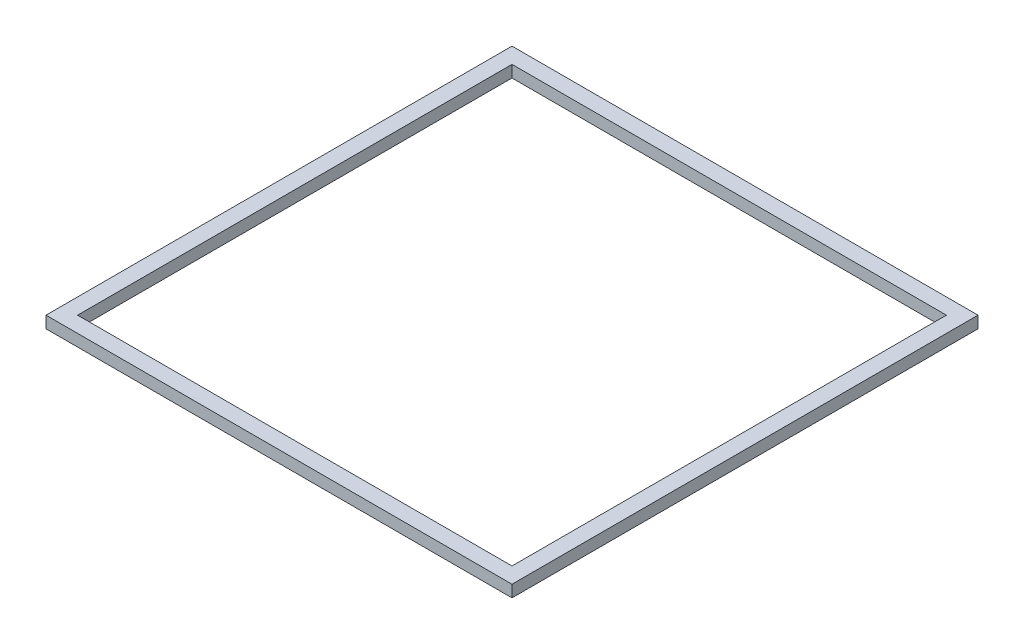
ISO-10303-21;
HEADER;
FILE_DESCRIPTION(('STEP AP214'),'2;1');
FILE_NAME('part.step','',(''),(''),'','','');
FILE_SCHEMA(('AUTOMOTIVE_DESIGN { 1 0 10303 214 1 1 1 1 }'));
ENDSEC;
DATA;
#1=APPLICATION_CONTEXT('core data for automotive mechanical design processes');
#2=APPLICATION_PROTOCOL_DEFINITION('international standard','automotive_design',2000,#1);
#3=PRODUCT_CONTEXT('',#1,'mechanical');
#4=PRODUCT('Part','Part','',(#3));
#5=PRODUCT_RELATED_PRODUCT_CATEGORY('part','',(#4));
#6=PRODUCT_DEFINITION_FORMATION('','',#4);
#7=PRODUCT_DEFINITION_CONTEXT('part definition',#1,'design');
#8=PRODUCT_DEFINITION('design','',#6,#7);
#9=PRODUCT_DEFINITION_SHAPE('','',#8);
#10=(LENGTH_UNIT() NAMED_UNIT(*) SI_UNIT(.MILLI.,.METRE.));
#11=(NAMED_UNIT(*) PLANE_ANGLE_UNIT() SI_UNIT($,.RADIAN.));
#12=(NAMED_UNIT(*) SI_UNIT($,.STERADIAN.) SOLID_ANGLE_UNIT());
#13=UNCERTAINTY_MEASURE_WITH_UNIT(LENGTH_MEASURE(1.E-05),#10,'distance_accuracy_value','');
#14=(GEOMETRIC_REPRESENTATION_CONTEXT(3) GLOBAL_UNCERTAINTY_ASSIGNED_CONTEXT((#13)) GLOBAL_UNIT_ASSIGNED_CONTEXT((#10,
#11,#12)) REPRESENTATION_CONTEXT('',''));
#15=CARTESIAN_POINT('',(0.,0.,0.));
#16=DIRECTION('',(0.,0.,1.));
#17=DIRECTION('',(1.,0.,0.));
#18=AXIS2_PLACEMENT_3D('',#15,#16,#17);
#19=CARTESIAN_POINT('',(0.,150.,0.));
#20=DIRECTION('',(0.,1.,0.));
#21=DIRECTION('',(0.,0.,1.));
#22=AXIS2_PLACEMENT_3D('',#19,#20,#21);
#23=PLANE('',#22);
#24=DIRECTION('',(0.,0.,-1.));
#25=VECTOR('',#24,1.);
#26=CARTESIAN_POINT('',(2950.,150.,-2950.));
#27=LINE('',#26,#25);
#28=CARTESIAN_POINT('',(2950.,150.,2950.));
#29=VERTEX_POINT('',#28);
#30=CARTESIAN_POINT('',(2950.,150.,-2950.));
#31=VERTEX_POINT('',#30);
#32=EDGE_CURVE('E137',#29,#31,#27,.T.);
#33=ORIENTED_EDGE('',*,*,#32,.T.);
#34=DIRECTION('',(-1.,0.,0.));
#35=VECTOR('',#34,1.);
#36=CARTESIAN_POINT('',(-2950.,150.,-2950.));
#37=LINE('',#36,#35);
#38=CARTESIAN_POINT('',(-2950.,150.,-2950.));
#39=VERTEX_POINT('',#38);
#40=EDGE_CURVE('E140',#31,#39,#37,.T.);
#41=ORIENTED_EDGE('',*,*,#40,.T.);
#42=DIRECTION('',(0.,0.,1.));
#43=VECTOR('',#42,1.);
#44=CARTESIAN_POINT('',(-2950.,150.,-2950.));
#45=LINE('',#44,#43);
#46=CARTESIAN_POINT('',(-2950.,150.,2950.));
#47=VERTEX_POINT('',#46);
#48=EDGE_CURVE('E143',#39,#47,#45,.T.);
#49=ORIENTED_EDGE('',*,*,#48,.T.);
#50=DIRECTION('',(1.,0.,0.));
#51=VECTOR('',#50,1.);
#52=CARTESIAN_POINT('',(-2950.,150.,2950.));
#53=LINE('',#52,#51);
#54=EDGE_CURVE('E145',#47,#29,#53,.T.);
#55=ORIENTED_EDGE('',*,*,#54,.T.);
#56=EDGE_LOOP('',(#33,#41,#49,#55));
#57=FACE_BOUND('',#56,.T.);
#58=DIRECTION('',(-1.,0.,0.));
#59=VECTOR('',#58,1.);
#60=CARTESIAN_POINT('',(-2750.,150.,-2750.));
#61=LINE('',#60,#59);
#62=CARTESIAN_POINT('',(2750.,150.,-2750.));
#63=VERTEX_POINT('',#62);
#64=CARTESIAN_POINT('',(-2750.,150.,-2750.));
#65=VERTEX_POINT('',#64);
#66=EDGE_CURVE('E109',#63,#65,#61,.T.);
#67=ORIENTED_EDGE('',*,*,#66,.F.);
#68=DIRECTION('',(0.,0.,-1.));
#69=VECTOR('',#68,1.);
#70=CARTESIAN_POINT('',(2750.,150.,-2750.));
#71=LINE('',#70,#69);
#72=CARTESIAN_POINT('',(2750.,150.,2750.));
#73=VERTEX_POINT('',#72);
#74=EDGE_CURVE('E101',#73,#63,#71,.T.);
#75=ORIENTED_EDGE('',*,*,#74,.F.);
#76=DIRECTION('',(1.,0.,0.));
#77=VECTOR('',#76,1.);
#78=CARTESIAN_POINT('',(-2750.,150.,2750.));
#79=LINE('',#78,#77);
#80=CARTESIAN_POINT('',(-2750.,150.,2750.));
#81=VERTEX_POINT('',#80);
#82=EDGE_CURVE('E123',#81,#73,#79,.T.);
#83=ORIENTED_EDGE('',*,*,#82,.F.);
#84=DIRECTION('',(0.,0.,1.));
#85=VECTOR('',#84,1.);
#86=CARTESIAN_POINT('',(-2750.,150.,-2750.));
#87=LINE('',#86,#85);
#88=EDGE_CURVE('E121',#65,#81,#87,.T.);
#89=ORIENTED_EDGE('',*,*,#88,.F.);
#90=EDGE_LOOP('',(#67,#75,#83,#89));
#91=FACE_BOUND('',#90,.T.);
#92=ADVANCED_FACE('F36',(#57,#91),#23,.T.);
#93=CARTESIAN_POINT('',(0.,0.,0.));
#94=DIRECTION('',(0.,1.,0.));
#95=DIRECTION('',(0.,0.,1.));
#96=AXIS2_PLACEMENT_3D('',#93,#94,#95);
#97=PLANE('',#96);
#98=DIRECTION('',(0.,0.,-1.));
#99=VECTOR('',#98,1.);
#100=CARTESIAN_POINT('',(2950.,0.,-2950.));
#101=LINE('',#100,#99);
#102=CARTESIAN_POINT('',(2950.,0.,2950.));
#103=VERTEX_POINT('',#102);
#104=CARTESIAN_POINT('',(2950.,0.,-2950.));
#105=VERTEX_POINT('',#104);
#106=EDGE_CURVE('E117',#103,#105,#101,.T.);
#107=ORIENTED_EDGE('',*,*,#106,.F.);
#108=DIRECTION('',(1.,0.,0.));
#109=VECTOR('',#108,1.);
#110=CARTESIAN_POINT('',(-2950.,0.,2950.));
#111=LINE('',#110,#109);
#112=CARTESIAN_POINT('',(-2950.,0.,2950.));
#113=VERTEX_POINT('',#112);
#114=EDGE_CURVE('E141',#113,#103,#111,.T.);
#115=ORIENTED_EDGE('',*,*,#114,.F.);
#116=DIRECTION('',(0.,0.,1.));
#117=VECTOR('',#116,1.);
#118=CARTESIAN_POINT('',(-2950.,0.,-2950.));
#119=LINE('',#118,#117);
#120=CARTESIAN_POINT('',(-2950.,0.,-2950.));
#121=VERTEX_POINT('',#120);
#122=EDGE_CURVE('E152',#121,#113,#119,.T.);
#123=ORIENTED_EDGE('',*,*,#122,.F.);
#124=DIRECTION('',(-1.,0.,0.));
#125=VECTOR('',#124,1.);
#126=CARTESIAN_POINT('',(-2950.,0.,-2950.));
#127=LINE('',#126,#125);
#128=EDGE_CURVE('E150',#105,#121,#127,.T.);
#129=ORIENTED_EDGE('',*,*,#128,.F.);
#130=EDGE_LOOP('',(#107,#115,#123,#129));
#131=FACE_BOUND('',#130,.T.);
#132=DIRECTION('',(0.,0.,-1.));
#133=VECTOR('',#132,1.);
#134=CARTESIAN_POINT('',(2750.,0.,-2750.));
#135=LINE('',#134,#133);
#136=CARTESIAN_POINT('',(2750.,0.,2750.));
#137=VERTEX_POINT('',#136);
#138=CARTESIAN_POINT('',(2750.,0.,-2750.));
#139=VERTEX_POINT('',#138);
#140=EDGE_CURVE('E59',#137,#139,#135,.T.);
#141=ORIENTED_EDGE('',*,*,#140,.T.);
#142=DIRECTION('',(-1.,0.,0.));
#143=VECTOR('',#142,1.);
#144=CARTESIAN_POINT('',(-2750.,0.,-2750.));
#145=LINE('',#144,#143);
#146=CARTESIAN_POINT('',(-2750.,0.,-2750.));
#147=VERTEX_POINT('',#146);
#148=EDGE_CURVE('E116',#139,#147,#145,.T.);
#149=ORIENTED_EDGE('',*,*,#148,.T.);
#150=DIRECTION('',(0.,0.,1.));
#151=VECTOR('',#150,1.);
#152=CARTESIAN_POINT('',(-2750.,0.,-2750.));
#153=LINE('',#152,#151);
#154=CARTESIAN_POINT('',(-2750.,0.,2750.));
#155=VERTEX_POINT('',#154);
#156=EDGE_CURVE('E129',#147,#155,#153,.T.);
#157=ORIENTED_EDGE('',*,*,#156,.T.);
#158=DIRECTION('',(1.,0.,0.));
#159=VECTOR('',#158,1.);
#160=CARTESIAN_POINT('',(-2750.,0.,2750.));
#161=LINE('',#160,#159);
#162=EDGE_CURVE('E110',#155,#137,#161,.T.);
#163=ORIENTED_EDGE('',*,*,#162,.T.);
#164=EDGE_LOOP('',(#141,#149,#157,#163));
#165=FACE_BOUND('',#164,.T.);
#166=ADVANCED_FACE('F170',(#131,#165),#97,.F.);
#167=CARTESIAN_POINT('',(2950.,150.,-2950.));
#168=DIRECTION('',(-1.,0.,0.));
#169=DIRECTION('',(0.,0.,1.));
#170=AXIS2_PLACEMENT_3D('',#167,#168,#169);
#171=PLANE('',#170);
#172=ORIENTED_EDGE('',*,*,#106,.T.);
#173=DIRECTION('',(0.,-1.,0.));
#174=VECTOR('',#173,1.);
#175=CARTESIAN_POINT('',(2950.,150.,-2950.));
#176=LINE('',#175,#174);
#177=EDGE_CURVE('E11',#31,#105,#176,.T.);
#178=ORIENTED_EDGE('',*,*,#177,.F.);
#179=ORIENTED_EDGE('',*,*,#32,.F.);
#180=DIRECTION('',(0.,-1.,0.));
#181=VECTOR('',#180,1.);
#182=CARTESIAN_POINT('',(2950.,150.,2950.));
#183=LINE('',#182,#181);
#184=EDGE_CURVE('E147',#29,#103,#183,.T.);
#185=ORIENTED_EDGE('',*,*,#184,.T.);
#186=EDGE_LOOP('',(#172,#178,#179,#185));
#187=FACE_BOUND('',#186,.T.);
#188=ADVANCED_FACE('F38',(#187),#171,.F.);
#189=CARTESIAN_POINT('',(-2950.,150.,-2950.));
#190=DIRECTION('',(0.,0.,1.));
#191=DIRECTION('',(1.,0.,0.));
#192=AXIS2_PLACEMENT_3D('',#189,#190,#191);
#193=PLANE('',#192);
#194=ORIENTED_EDGE('',*,*,#128,.T.);
#195=DIRECTION('',(0.,-1.,0.));
#196=VECTOR('',#195,1.);
#197=CARTESIAN_POINT('',(-2950.,150.,-2950.));
#198=LINE('',#197,#196);
#199=EDGE_CURVE('E44',#39,#121,#198,.T.);
#200=ORIENTED_EDGE('',*,*,#199,.F.);
#201=ORIENTED_EDGE('',*,*,#40,.F.);
#202=ORIENTED_EDGE('',*,*,#177,.T.);
#203=EDGE_LOOP('',(#194,#200,#201,#202));
#204=FACE_BOUND('',#203,.T.);
#205=ADVANCED_FACE('F180',(#204),#193,.F.);
#206=CARTESIAN_POINT('',(-2950.,150.,-2950.));
#207=DIRECTION('',(1.,0.,0.));
#208=DIRECTION('',(0.,0.,-1.));
#209=AXIS2_PLACEMENT_3D('',#206,#207,#208);
#210=PLANE('',#209);
#211=ORIENTED_EDGE('',*,*,#122,.T.);
#212=DIRECTION('',(0.,-1.,0.));
#213=VECTOR('',#212,1.);
#214=CARTESIAN_POINT('',(-2950.,150.,2950.));
#215=LINE('',#214,#213);
#216=EDGE_CURVE('E157',#47,#113,#215,.T.);
#217=ORIENTED_EDGE('',*,*,#216,.F.);
#218=ORIENTED_EDGE('',*,*,#48,.F.);
#219=ORIENTED_EDGE('',*,*,#199,.T.);
#220=EDGE_LOOP('',(#211,#217,#218,#219));
#221=FACE_BOUND('',#220,.T.);
#222=ADVANCED_FACE('F164',(#221),#210,.F.);
#223=CARTESIAN_POINT('',(-2950.,150.,2950.));
#224=DIRECTION('',(0.,0.,-1.));
#225=DIRECTION('',(-1.,0.,0.));
#226=AXIS2_PLACEMENT_3D('',#223,#224,#225);
#227=PLANE('',#226);
#228=ORIENTED_EDGE('',*,*,#114,.T.);
#229=ORIENTED_EDGE('',*,*,#184,.F.);
#230=ORIENTED_EDGE('',*,*,#54,.F.);
#231=ORIENTED_EDGE('',*,*,#216,.T.);
#232=EDGE_LOOP('',(#228,#229,#230,#231));
#233=FACE_BOUND('',#232,.T.);
#234=ADVANCED_FACE('F174',(#233),#227,.F.);
#235=CARTESIAN_POINT('',(2750.,150.,-2750.));
#236=DIRECTION('',(-1.,0.,0.));
#237=DIRECTION('',(0.,0.,1.));
#238=AXIS2_PLACEMENT_3D('',#235,#236,#237);
#239=PLANE('',#238);
#240=ORIENTED_EDGE('',*,*,#140,.F.);
#241=DIRECTION('',(0.,-1.,0.));
#242=VECTOR('',#241,1.);
#243=CARTESIAN_POINT('',(2750.,150.,2750.));
#244=LINE('',#243,#242);
#245=EDGE_CURVE('E105',#73,#137,#244,.T.);
#246=ORIENTED_EDGE('',*,*,#245,.F.);
#247=ORIENTED_EDGE('',*,*,#74,.T.);
#248=DIRECTION('',(0.,-1.,0.));
#249=VECTOR('',#248,1.);
#250=CARTESIAN_POINT('',(2750.,150.,-2750.));
#251=LINE('',#250,#249);
#252=EDGE_CURVE('E104',#63,#139,#251,.T.);
#253=ORIENTED_EDGE('',*,*,#252,.T.);
#254=EDGE_LOOP('',(#240,#246,#247,#253));
#255=FACE_BOUND('',#254,.T.);
#256=ADVANCED_FACE('F103',(#255),#239,.T.);
#257=CARTESIAN_POINT('',(-2750.,150.,-2750.));
#258=DIRECTION('',(0.,0.,1.));
#259=DIRECTION('',(1.,0.,0.));
#260=AXIS2_PLACEMENT_3D('',#257,#258,#259);
#261=PLANE('',#260);
#262=ORIENTED_EDGE('',*,*,#148,.F.);
#263=ORIENTED_EDGE('',*,*,#252,.F.);
#264=ORIENTED_EDGE('',*,*,#66,.T.);
#265=DIRECTION('',(0.,-1.,0.));
#266=VECTOR('',#265,1.);
#267=CARTESIAN_POINT('',(-2750.,150.,-2750.));
#268=LINE('',#267,#266);
#269=EDGE_CURVE('E118',#65,#147,#268,.T.);
#270=ORIENTED_EDGE('',*,*,#269,.T.);
#271=EDGE_LOOP('',(#262,#263,#264,#270));
#272=FACE_BOUND('',#271,.T.);
#273=ADVANCED_FACE('F113',(#272),#261,.T.);
#274=CARTESIAN_POINT('',(-2750.,150.,-2750.));
#275=DIRECTION('',(1.,0.,0.));
#276=DIRECTION('',(0.,0.,-1.));
#277=AXIS2_PLACEMENT_3D('',#274,#275,#276);
#278=PLANE('',#277);
#279=ORIENTED_EDGE('',*,*,#156,.F.);
#280=ORIENTED_EDGE('',*,*,#269,.F.);
#281=ORIENTED_EDGE('',*,*,#88,.T.);
#282=DIRECTION('',(0.,-1.,0.));
#283=VECTOR('',#282,1.);
#284=CARTESIAN_POINT('',(-2750.,150.,2750.));
#285=LINE('',#284,#283);
#286=EDGE_CURVE('E51',#81,#155,#285,.T.);
#287=ORIENTED_EDGE('',*,*,#286,.T.);
#288=EDGE_LOOP('',(#279,#280,#281,#287));
#289=FACE_BOUND('',#288,.T.);
#290=ADVANCED_FACE('F203',(#289),#278,.T.);
#291=CARTESIAN_POINT('',(-2750.,150.,2750.));
#292=DIRECTION('',(0.,0.,-1.));
#293=DIRECTION('',(-1.,0.,0.));
#294=AXIS2_PLACEMENT_3D('',#291,#292,#293);
#295=PLANE('',#294);
#296=ORIENTED_EDGE('',*,*,#162,.F.);
#297=ORIENTED_EDGE('',*,*,#286,.F.);
#298=ORIENTED_EDGE('',*,*,#82,.T.);
#299=ORIENTED_EDGE('',*,*,#245,.T.);
#300=EDGE_LOOP('',(#296,#297,#298,#299));
#301=FACE_BOUND('',#300,.T.);
#302=ADVANCED_FACE('F207',(#301),#295,.T.);
#303=CLOSED_SHELL('',(#92,#166,#188,#205,#222,#234,#256,#273,#290,#302));
#304=MANIFOLD_SOLID_BREP('B2',#303);
#305=ADVANCED_BREP_SHAPE_REPRESENTATION('',(#18,#304),#14);
#306=SHAPE_DEFINITION_REPRESENTATION(#9,#305);
ENDSEC;
END-ISO-10303-21;
